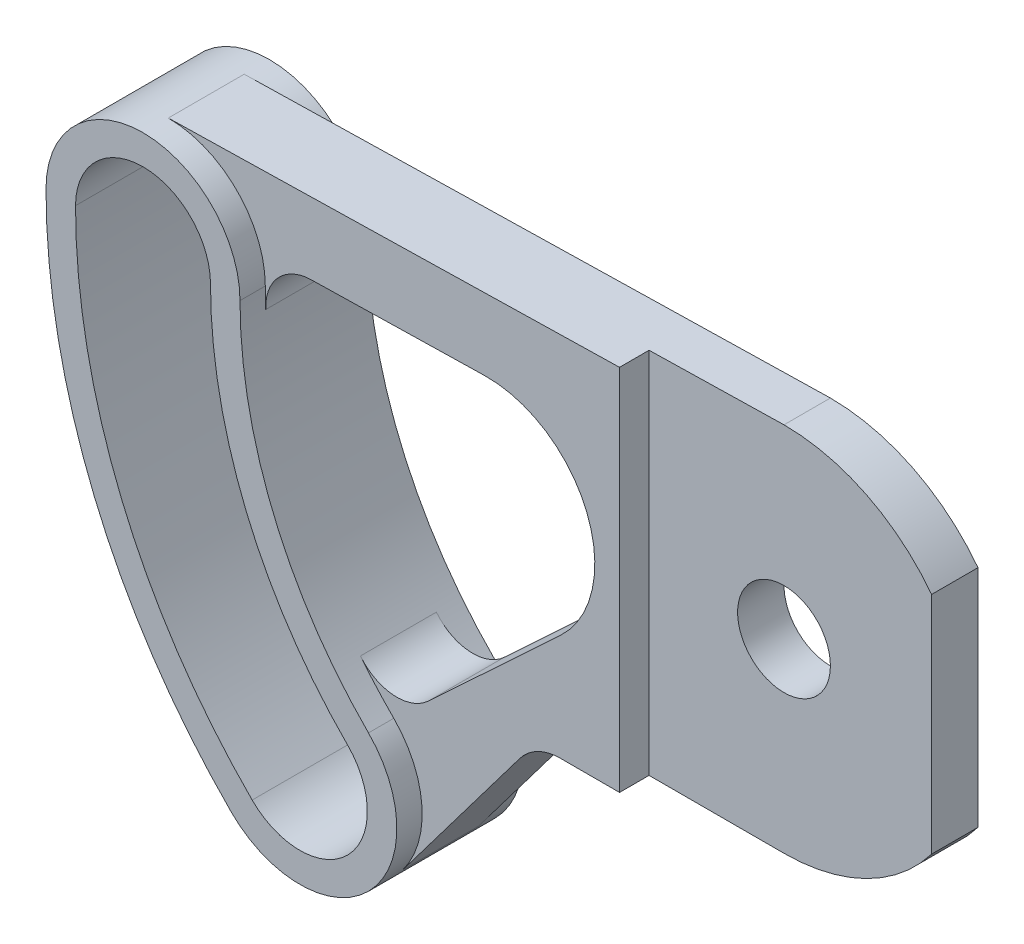
ISO-10303-21;
HEADER;
FILE_DESCRIPTION(('STEP AP214'),'2;1');
FILE_NAME('part.step','',(''),(''),'','','');
FILE_SCHEMA(('AUTOMOTIVE_DESIGN { 1 0 10303 214 1 1 1 1 }'));
ENDSEC;
DATA;
#1=APPLICATION_CONTEXT('core data for automotive mechanical design processes');
#2=APPLICATION_PROTOCOL_DEFINITION('international standard','automotive_design',2000,#1);
#3=PRODUCT_CONTEXT('',#1,'mechanical');
#4=PRODUCT('Part','Part','',(#3));
#5=PRODUCT_RELATED_PRODUCT_CATEGORY('part','',(#4));
#6=PRODUCT_DEFINITION_FORMATION('','',#4);
#7=PRODUCT_DEFINITION_CONTEXT('part definition',#1,'design');
#8=PRODUCT_DEFINITION('design','',#6,#7);
#9=PRODUCT_DEFINITION_SHAPE('','',#8);
#10=(LENGTH_UNIT() NAMED_UNIT(*) SI_UNIT(.MILLI.,.METRE.));
#11=(NAMED_UNIT(*) PLANE_ANGLE_UNIT() SI_UNIT($,.RADIAN.));
#12=(NAMED_UNIT(*) SI_UNIT($,.STERADIAN.) SOLID_ANGLE_UNIT());
#13=UNCERTAINTY_MEASURE_WITH_UNIT(LENGTH_MEASURE(1.E-05),#10,'distance_accuracy_value','');
#14=(GEOMETRIC_REPRESENTATION_CONTEXT(3) GLOBAL_UNCERTAINTY_ASSIGNED_CONTEXT((#13)) GLOBAL_UNIT_ASSIGNED_CONTEXT((#10,
#11,#12)) REPRESENTATION_CONTEXT('',''));
#15=CARTESIAN_POINT('',(0.,0.,0.));
#16=DIRECTION('',(0.,0.,1.));
#17=DIRECTION('',(1.,0.,0.));
#18=AXIS2_PLACEMENT_3D('',#15,#16,#17);
#19=CARTESIAN_POINT('',(0.,-44.,9.));
#20=DIRECTION('',(0.,-1.,0.));
#21=DIRECTION('',(1.,0.,0.));
#22=AXIS2_PLACEMENT_3D('',#19,#20,#21);
#23=PLANE('',#22);
#24=DIRECTION('',(1.,0.,0.));
#25=VECTOR('',#24,1.);
#26=CARTESIAN_POINT('',(0.,-44.,2.));
#27=LINE('',#26,#25);
#28=CARTESIAN_POINT('',(-32.,-44.,2.));
#29=VERTEX_POINT('',#28);
#30=CARTESIAN_POINT('',(0.,-44.,2.));
#31=VERTEX_POINT('',#30);
#32=EDGE_CURVE('E231',#29,#31,#27,.T.);
#33=ORIENTED_EDGE('',*,*,#32,.F.);
#34=DIRECTION('',(0.,0.,1.));
#35=VECTOR('',#34,1.);
#36=CARTESIAN_POINT('',(-32.,-44.,2.));
#37=LINE('',#36,#35);
#38=CARTESIAN_POINT('',(-32.,-44.,9.));
#39=VERTEX_POINT('',#38);
#40=EDGE_CURVE('E423',#29,#39,#37,.T.);
#41=ORIENTED_EDGE('',*,*,#40,.T.);
#42=DIRECTION('',(-1.,0.,0.));
#43=VECTOR('',#42,1.);
#44=CARTESIAN_POINT('',(0.,-44.,9.));
#45=LINE('',#44,#43);
#46=CARTESIAN_POINT('',(-46.0230624453333,-44.,9.));
#47=VERTEX_POINT('',#46);
#48=EDGE_CURVE('E412',#39,#47,#45,.T.);
#49=ORIENTED_EDGE('',*,*,#48,.T.);
#50=DIRECTION('',(0.,0.,-1.));
#51=VECTOR('',#50,1.);
#52=CARTESIAN_POINT('',(-46.0230624453333,-44.,9.));
#53=LINE('',#52,#51);
#54=CARTESIAN_POINT('',(-46.0230624453333,-44.,-9.));
#55=VERTEX_POINT('',#54);
#56=EDGE_CURVE('E256',#47,#55,#53,.T.);
#57=ORIENTED_EDGE('',*,*,#56,.T.);
#58=DIRECTION('',(-1.,0.,0.));
#59=VECTOR('',#58,1.);
#60=CARTESIAN_POINT('',(0.,-44.,-9.));
#61=LINE('',#60,#59);
#62=CARTESIAN_POINT('',(0.,-44.,-9.));
#63=VERTEX_POINT('',#62);
#64=EDGE_CURVE('E260',#63,#55,#61,.T.);
#65=ORIENTED_EDGE('',*,*,#64,.F.);
#66=DIRECTION('',(0.,0.,-1.));
#67=VECTOR('',#66,1.);
#68=CARTESIAN_POINT('',(0.,-44.,9.));
#69=LINE('',#68,#67);
#70=EDGE_CURVE('E248',#31,#63,#69,.T.);
#71=ORIENTED_EDGE('',*,*,#70,.F.);
#72=EDGE_LOOP('',(#33,#41,#49,#57,#65,#71));
#73=FACE_BOUND('',#72,.T.);
#74=ADVANCED_FACE('F61',(#73),#23,.T.);
#75=CARTESIAN_POINT('',(0.,0.,9.));
#76=DIRECTION('',(0.,0.,1.));
#77=DIRECTION('',(1.,0.,0.));
#78=AXIS2_PLACEMENT_3D('',#75,#76,#77);
#79=PLANE('',#78);
#80=ORIENTED_EDGE('',*,*,#48,.F.);
#81=DIRECTION('',(0.,1.,0.));
#82=VECTOR('',#81,1.);
#83=CARTESIAN_POINT('',(-32.,0.,9.));
#84=LINE('',#83,#82);
#85=CARTESIAN_POINT('',(-32.,43.3093525179856,9.));
#86=VERTEX_POINT('',#85);
#87=EDGE_CURVE('E243',#39,#86,#84,.T.);
#88=ORIENTED_EDGE('',*,*,#87,.T.);
#89=DIRECTION('',(0.999767174137652,0.0215777087943381,0.));
#90=VECTOR('',#89,1.);
#91=CARTESIAN_POINT('',(-0.949198137609943,43.9795137092602,9.));
#92=LINE('',#91,#90);
#93=CARTESIAN_POINT('',(-139.,41.,9.));
#94=VERTEX_POINT('',#93);
#95=EDGE_CURVE('E415',#94,#86,#92,.T.);
#96=ORIENTED_EDGE('',*,*,#95,.F.);
#97=CARTESIAN_POINT('',(-139.,18.,9.));
#98=DIRECTION('',(0.,0.,1.));
#99=DIRECTION('',(1.,0.,0.));
#100=AXIS2_PLACEMENT_3D('',#97,#98,#99);
#101=CIRCLE('',#100,23.);
#102=CARTESIAN_POINT('',(-116.,18.,9.));
#103=VERTEX_POINT('',#102);
#104=EDGE_CURVE('E418',#103,#94,#101,.T.);
#105=ORIENTED_EDGE('',*,*,#104,.F.);
#106=CARTESIAN_POINT('',(-12.,18.,9.));
#107=DIRECTION('',(0.,0.,1.));
#108=DIRECTION('',(1.,0.,0.));
#109=AXIS2_PLACEMENT_3D('',#106,#107,#108);
#110=CIRCLE('',#109,104.);
#111=CARTESIAN_POINT('',(-115.890292858977,13.2243273064394,9.));
#112=VERTEX_POINT('',#111);
#113=EDGE_CURVE('E346',#112,#103,#110,.F.);
#114=ORIENTED_EDGE('',*,*,#113,.F.);
#115=CARTESIAN_POINT('',(-104.901896498893,13.7294465336429,9.));
#116=DIRECTION('',(0.,0.,1.));
#117=DIRECTION('',(1.,0.,0.));
#118=AXIS2_PLACEMENT_3D('',#115,#116,#117);
#119=CIRCLE('',#118,11.);
#120=CARTESIAN_POINT('',(-105.139251295631,24.7268854491571,9.));
#121=VERTEX_POINT('',#120);
#122=EDGE_CURVE('E363',#112,#121,#119,.F.);
#123=ORIENTED_EDGE('',*,*,#122,.T.);
#124=DIRECTION('',(0.999767174137652,0.021577708794338,0.));
#125=VECTOR('',#124,1.);
#126=CARTESIAN_POINT('',(-0.582377883805446,26.9835086163188,9.));
#127=LINE('',#126,#125);
#128=CARTESIAN_POINT('',(-64.0329053283729,25.6140727721914,9.));
#129=VERTEX_POINT('',#128);
#130=EDGE_CURVE('E449',#121,#129,#127,.T.);
#131=ORIENTED_EDGE('',*,*,#130,.T.);
#132=CARTESIAN_POINT('',(-63.4800836138652,0.,9.));
#133=DIRECTION('',(0.,0.,1.));
#134=DIRECTION('',(1.,0.,0.));
#135=AXIS2_PLACEMENT_3D('',#132,#133,#134);
#136=CIRCLE('',#135,25.6200377795808);
#137=CARTESIAN_POINT('',(-46.0230624453333,-18.7520331630621,9.));
#138=VERTEX_POINT('',#137);
#139=EDGE_CURVE('E403',#138,#129,#136,.T.);
#140=ORIENTED_EDGE('',*,*,#139,.F.);
#141=DIRECTION('',(-0.731928396218349,-0.681381554497357,0.));
#142=VECTOR('',#141,1.);
#143=CARTESIAN_POINT('',(-12.0155642837125,12.9069133700336,9.));
#144=LINE('',#143,#142);
#145=CARTESIAN_POINT('',(-77.3274929863889,-47.894585433101,9.));
#146=VERTEX_POINT('',#145);
#147=EDGE_CURVE('E390',#138,#146,#144,.T.);
#148=ORIENTED_EDGE('',*,*,#147,.T.);
#149=CARTESIAN_POINT('',(-84.8226900858598,-39.8433730746991,9.));
#150=DIRECTION('',(0.,0.,1.));
#151=DIRECTION('',(1.,0.,0.));
#152=AXIS2_PLACEMENT_3D('',#149,#150,#151);
#153=CIRCLE('',#152,11.);
#154=CARTESIAN_POINT('',(-93.4361265476281,-46.6850623631044,9.));
#155=VERTEX_POINT('',#154);
#156=EDGE_CURVE('E12',#146,#155,#153,.F.);
#157=ORIENTED_EDGE('',*,*,#156,.T.);
#158=CARTESIAN_POINT('',(-12.,18.,9.));
#159=DIRECTION('',(0.,0.,1.));
#160=DIRECTION('',(1.,0.,0.));
#161=AXIS2_PLACEMENT_3D('',#158,#159,#160);
#162=CIRCLE('',#161,104.);
#163=CARTESIAN_POINT('',(-85.5391052434008,-55.5391052434011,9.));
#164=VERTEX_POINT('',#163);
#165=EDGE_CURVE('E79',#164,#155,#162,.F.);
#166=ORIENTED_EDGE('',*,*,#165,.F.);
#167=CARTESIAN_POINT('',(-101.802561210691,-71.8025612106917,9.));
#168=DIRECTION('',(0.,0.,1.));
#169=DIRECTION('',(1.,0.,0.));
#170=AXIS2_PLACEMENT_3D('',#167,#168,#169);
#171=CIRCLE('',#170,23.);
#172=CARTESIAN_POINT('',(-83.445115781445,-85.6591191278745,9.));
#173=VERTEX_POINT('',#172);
#174=EDGE_CURVE('E397',#173,#164,#171,.T.);
#175=ORIENTED_EDGE('',*,*,#174,.F.);
#176=DIRECTION('',(-0.602459039877512,-0.798149801271582,0.));
#177=VECTOR('',#176,1.);
#178=CARTESIAN_POINT('',(-11.9687287041228,9.03422990540433,9.));
#179=LINE('',#178,#177);
#180=CARTESIAN_POINT('',(-55.6008600605924,-48.7704915214699,9.));
#181=VERTEX_POINT('',#180);
#182=EDGE_CURVE('E402',#181,#173,#179,.T.);
#183=ORIENTED_EDGE('',*,*,#182,.F.);
#184=CARTESIAN_POINT('',(-46.0230624453333,-56.,9.));
#185=DIRECTION('',(0.,0.,1.));
#186=DIRECTION('',(1.,0.,0.));
#187=AXIS2_PLACEMENT_3D('',#184,#185,#186);
#188=CIRCLE('',#187,12.);
#189=EDGE_CURVE('E401',#47,#181,#188,.T.);
#190=ORIENTED_EDGE('',*,*,#189,.F.);
#191=EDGE_LOOP('',(#80,#88,#96,#105,#114,#123,#131,#140,#148,#157,#166,#175,#183,#190));
#192=FACE_BOUND('',#191,.T.);
#193=ADVANCED_FACE('F384',(#192),#79,.T.);
#194=CARTESIAN_POINT('',(0.,0.,9.));
#195=DIRECTION('',(0.,0.,-1.));
#196=DIRECTION('',(-1.,0.,0.));
#197=AXIS2_PLACEMENT_3D('',#194,#195,#196);
#198=CYLINDRICAL_SURFACE('',#197,44.);
#199=CARTESIAN_POINT('',(0.,0.,2.));
#200=DIRECTION('',(0.,0.,1.));
#201=DIRECTION('',(1.,0.,0.));
#202=AXIS2_PLACEMENT_3D('',#199,#200,#201);
#203=CIRCLE('',#202,44.);
#204=CARTESIAN_POINT('',(35.,-26.6645832519468,2.));
#205=VERTEX_POINT('',#204);
#206=EDGE_CURVE('E240',#31,#205,#203,.T.);
#207=ORIENTED_EDGE('',*,*,#206,.F.);
#208=ORIENTED_EDGE('',*,*,#70,.T.);
#209=CARTESIAN_POINT('',(0.,0.,-9.));
#210=DIRECTION('',(0.,0.,1.));
#211=DIRECTION('',(1.,0.,0.));
#212=AXIS2_PLACEMENT_3D('',#209,#210,#211);
#213=CIRCLE('',#212,44.);
#214=CARTESIAN_POINT('',(35.,-26.6645832519468,-9.));
#215=VERTEX_POINT('',#214);
#216=EDGE_CURVE('E431',#63,#215,#213,.T.);
#217=ORIENTED_EDGE('',*,*,#216,.T.);
#218=DIRECTION('',(0.,0.,-1.));
#219=VECTOR('',#218,1.);
#220=CARTESIAN_POINT('',(35.,-26.6645832519468,9.));
#221=LINE('',#220,#219);
#222=EDGE_CURVE('E252',#205,#215,#221,.T.);
#223=ORIENTED_EDGE('',*,*,#222,.F.);
#224=EDGE_LOOP('',(#207,#208,#217,#223));
#225=FACE_BOUND('',#224,.T.);
#226=ADVANCED_FACE('F250',(#225),#198,.T.);
#227=CARTESIAN_POINT('',(0.,0.,9.));
#228=DIRECTION('',(0.,0.,-1.));
#229=DIRECTION('',(-1.,0.,0.));
#230=AXIS2_PLACEMENT_3D('',#227,#228,#229);
#231=CYLINDRICAL_SURFACE('',#230,44.);
#232=CARTESIAN_POINT('',(0.,0.,2.));
#233=DIRECTION('',(0.,0.,1.));
#234=DIRECTION('',(1.,0.,0.));
#235=AXIS2_PLACEMENT_3D('',#232,#233,#234);
#236=CIRCLE('',#235,44.);
#237=CARTESIAN_POINT('',(35.,26.6645832519468,2.));
#238=VERTEX_POINT('',#237);
#239=CARTESIAN_POINT('',(-1.5330618718945E-13,44.,2.));
#240=VERTEX_POINT('',#239);
#241=EDGE_CURVE('E453',#238,#240,#236,.T.);
#242=ORIENTED_EDGE('',*,*,#241,.F.);
#243=DIRECTION('',(0.,0.,-1.));
#244=VECTOR('',#243,1.);
#245=CARTESIAN_POINT('',(35.,26.6645832519468,9.));
#246=LINE('',#245,#244);
#247=CARTESIAN_POINT('',(35.,26.6645832519468,-9.));
#248=VERTEX_POINT('',#247);
#249=EDGE_CURVE('E265',#238,#248,#246,.T.);
#250=ORIENTED_EDGE('',*,*,#249,.T.);
#251=CARTESIAN_POINT('',(0.,0.,-9.));
#252=DIRECTION('',(0.,0.,1.));
#253=DIRECTION('',(1.,0.,0.));
#254=AXIS2_PLACEMENT_3D('',#251,#252,#253);
#255=CIRCLE('',#254,44.);
#256=CARTESIAN_POINT('',(-1.53631447841196E-13,44.,-9.));
#257=VERTEX_POINT('',#256);
#258=EDGE_CURVE('E436',#248,#257,#255,.T.);
#259=ORIENTED_EDGE('',*,*,#258,.T.);
#260=DIRECTION('',(0.,0.,-1.));
#261=VECTOR('',#260,1.);
#262=CARTESIAN_POINT('',(-1.53631447841196E-13,44.,9.));
#263=LINE('',#262,#261);
#264=EDGE_CURVE('E450',#240,#257,#263,.T.);
#265=ORIENTED_EDGE('',*,*,#264,.F.);
#266=EDGE_LOOP('',(#242,#250,#259,#265));
#267=FACE_BOUND('',#266,.T.);
#268=ADVANCED_FACE('F454',(#267),#231,.T.);
#269=CARTESIAN_POINT('',(0.,0.,9.));
#270=DIRECTION('',(0.,0.,-1.));
#271=DIRECTION('',(-1.,0.,0.));
#272=AXIS2_PLACEMENT_3D('',#269,#270,#271);
#273=CYLINDRICAL_SURFACE('',#272,11.);
#274=CARTESIAN_POINT('',(0.,0.,-9.));
#275=DIRECTION('',(0.,0.,1.));
#276=DIRECTION('',(1.,0.,0.));
#277=AXIS2_PLACEMENT_3D('',#274,#275,#276);
#278=CIRCLE('',#277,11.);
#279=CARTESIAN_POINT('',(11.,0.,-9.));
#280=VERTEX_POINT('',#279);
#281=EDGE_CURVE('E444',#280,#280,#278,.T.);
#282=ORIENTED_EDGE('',*,*,#281,.F.);
#283=EDGE_LOOP('',(#282));
#284=FACE_BOUND('',#283,.T.);
#285=CARTESIAN_POINT('',(0.,0.,2.));
#286=DIRECTION('',(0.,0.,1.));
#287=DIRECTION('',(1.,0.,0.));
#288=AXIS2_PLACEMENT_3D('',#285,#286,#287);
#289=CIRCLE('',#288,11.);
#290=CARTESIAN_POINT('',(11.,0.,2.));
#291=VERTEX_POINT('',#290);
#292=EDGE_CURVE('E474',#291,#291,#289,.T.);
#293=ORIENTED_EDGE('',*,*,#292,.T.);
#294=EDGE_LOOP('',(#293));
#295=FACE_BOUND('',#294,.T.);
#296=ADVANCED_FACE('F543',(#284,#295),#273,.F.);
#297=CARTESIAN_POINT('',(-101.802561210691,-71.8025612106917,15.));
#298=DIRECTION('',(0.,0.,-1.));
#299=DIRECTION('',(-1.,0.,0.));
#300=AXIS2_PLACEMENT_3D('',#297,#298,#299);
#301=CYLINDRICAL_SURFACE('',#300,23.);
#302=CARTESIAN_POINT('',(-101.802561210691,-71.8025612106917,-9.));
#303=DIRECTION('',(0.,0.,1.));
#304=DIRECTION('',(1.,0.,0.));
#305=AXIS2_PLACEMENT_3D('',#302,#303,#304);
#306=CIRCLE('',#305,23.);
#307=CARTESIAN_POINT('',(-83.445115781445,-85.6591191278745,-9.));
#308=VERTEX_POINT('',#307);
#309=CARTESIAN_POINT('',(-85.5391052434008,-55.5391052434011,-9.));
#310=VERTEX_POINT('',#309);
#311=EDGE_CURVE('E379',#308,#310,#306,.T.);
#312=ORIENTED_EDGE('',*,*,#311,.F.);
#313=DIRECTION('',(0.,0.,-1.));
#314=VECTOR('',#313,1.);
#315=CARTESIAN_POINT('',(-83.445115781445,-85.6591191278745,9.));
#316=LINE('',#315,#314);
#317=EDGE_CURVE('E270',#173,#308,#316,.T.);
#318=ORIENTED_EDGE('',*,*,#317,.F.);
#319=ORIENTED_EDGE('',*,*,#174,.T.);
#320=DIRECTION('',(0.,0.,-1.));
#321=VECTOR('',#320,1.);
#322=CARTESIAN_POINT('',(-85.5391052434008,-55.5391052434011,15.));
#323=LINE('',#322,#321);
#324=CARTESIAN_POINT('',(-85.5391052434008,-55.5391052434011,15.));
#325=VERTEX_POINT('',#324);
#326=EDGE_CURVE('E327',#325,#164,#323,.T.);
#327=ORIENTED_EDGE('',*,*,#326,.F.);
#328=CARTESIAN_POINT('',(-101.802561210691,-71.8025612106917,15.));
#329=DIRECTION('',(0.,0.,1.));
#330=DIRECTION('',(1.,0.,0.));
#331=AXIS2_PLACEMENT_3D('',#328,#329,#330);
#332=CIRCLE('',#331,23.);
#333=CARTESIAN_POINT('',(-118.066017177982,-88.0660171779823,15.));
#334=VERTEX_POINT('',#333);
#335=EDGE_CURVE('E288',#334,#325,#332,.T.);
#336=ORIENTED_EDGE('',*,*,#335,.F.);
#337=DIRECTION('',(0.,0.,-1.));
#338=VECTOR('',#337,1.);
#339=CARTESIAN_POINT('',(-118.066017177982,-88.0660171779823,15.));
#340=LINE('',#339,#338);
#341=CARTESIAN_POINT('',(-118.066017177982,-88.0660171779823,-15.));
#342=VERTEX_POINT('',#341);
#343=EDGE_CURVE('E329',#334,#342,#340,.T.);
#344=ORIENTED_EDGE('',*,*,#343,.T.);
#345=CARTESIAN_POINT('',(-101.802561210691,-71.8025612106917,-15.));
#346=DIRECTION('',(0.,0.,1.));
#347=DIRECTION('',(1.,0.,0.));
#348=AXIS2_PLACEMENT_3D('',#345,#346,#347);
#349=CIRCLE('',#348,23.);
#350=CARTESIAN_POINT('',(-85.5391052434008,-55.5391052434011,-15.));
#351=VERTEX_POINT('',#350);
#352=EDGE_CURVE('E315',#342,#351,#349,.T.);
#353=ORIENTED_EDGE('',*,*,#352,.T.);
#354=EDGE_CURVE('E330',#310,#351,#323,.T.);
#355=ORIENTED_EDGE('',*,*,#354,.F.);
#356=EDGE_LOOP('',(#312,#318,#319,#327,#336,#344,#353,#355));
#357=FACE_BOUND('',#356,.T.);
#358=ADVANCED_FACE('F400',(#357),#301,.T.);
#359=CARTESIAN_POINT('',(-12.,18.,15.));
#360=DIRECTION('',(0.,0.,-1.));
#361=DIRECTION('',(-1.,0.,0.));
#362=AXIS2_PLACEMENT_3D('',#359,#360,#361);
#363=CYLINDRICAL_SURFACE('',#362,150.);
#364=CARTESIAN_POINT('',(-12.,18.,-15.));
#365=DIRECTION('',(0.,0.,1.));
#366=DIRECTION('',(1.,0.,0.));
#367=AXIS2_PLACEMENT_3D('',#364,#365,#366);
#368=CIRCLE('',#367,150.);
#369=CARTESIAN_POINT('',(-162.,18.,-15.));
#370=VERTEX_POINT('',#369);
#371=EDGE_CURVE('E310',#370,#342,#368,.T.);
#372=ORIENTED_EDGE('',*,*,#371,.T.);
#373=ORIENTED_EDGE('',*,*,#343,.F.);
#374=CARTESIAN_POINT('',(-12.,18.,15.));
#375=DIRECTION('',(0.,0.,1.));
#376=DIRECTION('',(1.,0.,0.));
#377=AXIS2_PLACEMENT_3D('',#374,#375,#376);
#378=CIRCLE('',#377,150.);
#379=CARTESIAN_POINT('',(-162.,18.,15.));
#380=VERTEX_POINT('',#379);
#381=EDGE_CURVE('E289',#380,#334,#378,.T.);
#382=ORIENTED_EDGE('',*,*,#381,.F.);
#383=DIRECTION('',(0.,0.,-1.));
#384=VECTOR('',#383,1.);
#385=CARTESIAN_POINT('',(-162.,18.,15.));
#386=LINE('',#385,#384);
#387=EDGE_CURVE('E317',#380,#370,#386,.T.);
#388=ORIENTED_EDGE('',*,*,#387,.T.);
#389=EDGE_LOOP('',(#372,#373,#382,#388));
#390=FACE_BOUND('',#389,.T.);
#391=ADVANCED_FACE('F539',(#390),#363,.T.);
#392=CARTESIAN_POINT('',(-12.,18.,15.));
#393=DIRECTION('',(0.,0.,-1.));
#394=DIRECTION('',(-1.,0.,0.));
#395=AXIS2_PLACEMENT_3D('',#392,#393,#394);
#396=CYLINDRICAL_SURFACE('',#395,104.);
#397=DIRECTION('',(0.,0.,-1.));
#398=VECTOR('',#397,1.);
#399=CARTESIAN_POINT('',(-116.,18.,15.));
#400=LINE('',#399,#398);
#401=CARTESIAN_POINT('',(-116.,18.,-9.));
#402=VERTEX_POINT('',#401);
#403=CARTESIAN_POINT('',(-116.,18.,-15.));
#404=VERTEX_POINT('',#403);
#405=EDGE_CURVE('E325',#402,#404,#400,.T.);
#406=ORIENTED_EDGE('',*,*,#405,.F.);
#407=CARTESIAN_POINT('',(-12.,18.,-9.));
#408=DIRECTION('',(0.,0.,1.));
#409=DIRECTION('',(1.,0.,0.));
#410=AXIS2_PLACEMENT_3D('',#407,#408,#409);
#411=CIRCLE('',#410,104.);
#412=CARTESIAN_POINT('',(-115.890292858977,13.2243273064394,-9.));
#413=VERTEX_POINT('',#412);
#414=EDGE_CURVE('E353',#402,#413,#411,.T.);
#415=ORIENTED_EDGE('',*,*,#414,.T.);
#416=DIRECTION('',(0.,0.,-1.));
#417=VECTOR('',#416,1.);
#418=CARTESIAN_POINT('',(-115.890292858977,13.2243273064394,15.));
#419=LINE('',#418,#417);
#420=EDGE_CURVE('E354',#413,#112,#419,.F.);
#421=ORIENTED_EDGE('',*,*,#420,.T.);
#422=ORIENTED_EDGE('',*,*,#113,.T.);
#423=CARTESIAN_POINT('',(-116.,18.,15.));
#424=VERTEX_POINT('',#423);
#425=EDGE_CURVE('E322',#424,#103,#400,.T.);
#426=ORIENTED_EDGE('',*,*,#425,.F.);
#427=CARTESIAN_POINT('',(-12.,18.,15.));
#428=DIRECTION('',(0.,0.,1.));
#429=DIRECTION('',(1.,0.,0.));
#430=AXIS2_PLACEMENT_3D('',#427,#428,#429);
#431=CIRCLE('',#430,104.);
#432=EDGE_CURVE('E295',#424,#325,#431,.T.);
#433=ORIENTED_EDGE('',*,*,#432,.T.);
#434=ORIENTED_EDGE('',*,*,#326,.T.);
#435=ORIENTED_EDGE('',*,*,#165,.T.);
#436=DIRECTION('',(0.,0.,-1.));
#437=VECTOR('',#436,1.);
#438=CARTESIAN_POINT('',(-93.4361265476281,-46.6850623631044,15.));
#439=LINE('',#438,#437);
#440=CARTESIAN_POINT('',(-93.4361265476281,-46.6850623631044,-9.));
#441=VERTEX_POINT('',#440);
#442=EDGE_CURVE('E345',#155,#441,#439,.T.);
#443=ORIENTED_EDGE('',*,*,#442,.T.);
#444=CARTESIAN_POINT('',(-12.,18.,-9.));
#445=DIRECTION('',(0.,0.,1.));
#446=DIRECTION('',(1.,0.,0.));
#447=AXIS2_PLACEMENT_3D('',#444,#445,#446);
#448=CIRCLE('',#447,104.);
#449=EDGE_CURVE('E347',#441,#310,#448,.T.);
#450=ORIENTED_EDGE('',*,*,#449,.T.);
#451=ORIENTED_EDGE('',*,*,#354,.T.);
#452=CARTESIAN_POINT('',(-12.,18.,-15.));
#453=DIRECTION('',(0.,0.,1.));
#454=DIRECTION('',(1.,0.,0.));
#455=AXIS2_PLACEMENT_3D('',#452,#453,#454);
#456=CIRCLE('',#455,104.);
#457=EDGE_CURVE('E312',#404,#351,#456,.T.);
#458=ORIENTED_EDGE('',*,*,#457,.F.);
#459=EDGE_LOOP('',(#406,#415,#421,#422,#426,#433,#434,#435,#443,#450,#451,#458));
#460=FACE_BOUND('',#459,.T.);
#461=ADVANCED_FACE('F388',(#460),#396,.F.);
#462=CARTESIAN_POINT('',(-139.,18.,15.));
#463=DIRECTION('',(0.,0.,-1.));
#464=DIRECTION('',(-1.,0.,0.));
#465=AXIS2_PLACEMENT_3D('',#462,#463,#464);
#466=CYLINDRICAL_SURFACE('',#465,16.);
#467=CARTESIAN_POINT('',(-139.,18.,-15.));
#468=DIRECTION('',(0.,0.,1.));
#469=DIRECTION('',(1.,0.,0.));
#470=AXIS2_PLACEMENT_3D('',#467,#468,#469);
#471=CIRCLE('',#470,16.);
#472=CARTESIAN_POINT('',(-123.,18.,-15.));
#473=VERTEX_POINT('',#472);
#474=CARTESIAN_POINT('',(-155.,18.,-15.));
#475=VERTEX_POINT('',#474);
#476=EDGE_CURVE('E273',#473,#475,#471,.T.);
#477=ORIENTED_EDGE('',*,*,#476,.F.);
#478=DIRECTION('',(0.,0.,-1.));
#479=VECTOR('',#478,1.);
#480=CARTESIAN_POINT('',(-123.,18.,15.));
#481=LINE('',#480,#479);
#482=CARTESIAN_POINT('',(-123.,18.,15.));
#483=VERTEX_POINT('',#482);
#484=EDGE_CURVE('E323',#483,#473,#481,.T.);
#485=ORIENTED_EDGE('',*,*,#484,.F.);
#486=CARTESIAN_POINT('',(-139.,18.,15.));
#487=DIRECTION('',(0.,0.,1.));
#488=DIRECTION('',(1.,0.,0.));
#489=AXIS2_PLACEMENT_3D('',#486,#487,#488);
#490=CIRCLE('',#489,16.);
#491=CARTESIAN_POINT('',(-155.,18.,15.));
#492=VERTEX_POINT('',#491);
#493=EDGE_CURVE('E274',#483,#492,#490,.T.);
#494=ORIENTED_EDGE('',*,*,#493,.T.);
#495=DIRECTION('',(0.,0.,-1.));
#496=VECTOR('',#495,1.);
#497=CARTESIAN_POINT('',(-155.,18.,15.));
#498=LINE('',#497,#496);
#499=EDGE_CURVE('E296',#492,#475,#498,.T.);
#500=ORIENTED_EDGE('',*,*,#499,.T.);
#501=EDGE_LOOP('',(#477,#485,#494,#500));
#502=FACE_BOUND('',#501,.T.);
#503=ADVANCED_FACE('F537',(#502),#466,.F.);
#504=CARTESIAN_POINT('',(-12.,18.,15.));
#505=DIRECTION('',(0.,0.,-1.));
#506=DIRECTION('',(-1.,0.,0.));
#507=AXIS2_PLACEMENT_3D('',#504,#505,#506);
#508=CYLINDRICAL_SURFACE('',#507,111.);
#509=CARTESIAN_POINT('',(-12.,18.,-15.));
#510=DIRECTION('',(0.,0.,1.));
#511=DIRECTION('',(1.,0.,0.));
#512=AXIS2_PLACEMENT_3D('',#509,#510,#511);
#513=CIRCLE('',#512,111.);
#514=CARTESIAN_POINT('',(-90.4888527117067,-60.488852711707,-15.));
#515=VERTEX_POINT('',#514);
#516=EDGE_CURVE('E297',#473,#515,#513,.T.);
#517=ORIENTED_EDGE('',*,*,#516,.T.);
#518=DIRECTION('',(0.,0.,-1.));
#519=VECTOR('',#518,1.);
#520=CARTESIAN_POINT('',(-90.4888527117067,-60.488852711707,15.));
#521=LINE('',#520,#519);
#522=CARTESIAN_POINT('',(-90.4888527117067,-60.488852711707,15.));
#523=VERTEX_POINT('',#522);
#524=EDGE_CURVE('E336',#523,#515,#521,.T.);
#525=ORIENTED_EDGE('',*,*,#524,.F.);
#526=CARTESIAN_POINT('',(-12.,18.,15.));
#527=DIRECTION('',(0.,0.,1.));
#528=DIRECTION('',(1.,0.,0.));
#529=AXIS2_PLACEMENT_3D('',#526,#527,#528);
#530=CIRCLE('',#529,111.);
#531=EDGE_CURVE('E279',#483,#523,#530,.T.);
#532=ORIENTED_EDGE('',*,*,#531,.F.);
#533=ORIENTED_EDGE('',*,*,#484,.T.);
#534=EDGE_LOOP('',(#517,#525,#532,#533));
#535=FACE_BOUND('',#534,.T.);
#536=ADVANCED_FACE('F554',(#535),#508,.T.);
#537=CARTESIAN_POINT('',(-101.802561210691,-71.8025612106917,15.));
#538=DIRECTION('',(0.,0.,-1.));
#539=DIRECTION('',(-1.,0.,0.));
#540=AXIS2_PLACEMENT_3D('',#537,#538,#539);
#541=CYLINDRICAL_SURFACE('',#540,16.);
#542=CARTESIAN_POINT('',(-101.802561210691,-71.8025612106917,-15.));
#543=DIRECTION('',(0.,0.,1.));
#544=DIRECTION('',(1.,0.,0.));
#545=AXIS2_PLACEMENT_3D('',#542,#543,#544);
#546=CIRCLE('',#545,16.);
#547=CARTESIAN_POINT('',(-113.116269709676,-83.1162697096764,-15.));
#548=VERTEX_POINT('',#547);
#549=EDGE_CURVE('E305',#548,#515,#546,.T.);
#550=ORIENTED_EDGE('',*,*,#549,.F.);
#551=DIRECTION('',(0.,0.,-1.));
#552=VECTOR('',#551,1.);
#553=CARTESIAN_POINT('',(-113.116269709676,-83.1162697096764,15.));
#554=LINE('',#553,#552);
#555=CARTESIAN_POINT('',(-113.116269709676,-83.1162697096764,15.));
#556=VERTEX_POINT('',#555);
#557=EDGE_CURVE('E333',#556,#548,#554,.T.);
#558=ORIENTED_EDGE('',*,*,#557,.F.);
#559=CARTESIAN_POINT('',(-101.802561210691,-71.8025612106917,15.));
#560=DIRECTION('',(0.,0.,1.));
#561=DIRECTION('',(1.,0.,0.));
#562=AXIS2_PLACEMENT_3D('',#559,#560,#561);
#563=CIRCLE('',#562,16.);
#564=EDGE_CURVE('E284',#556,#523,#563,.T.);
#565=ORIENTED_EDGE('',*,*,#564,.T.);
#566=ORIENTED_EDGE('',*,*,#524,.T.);
#567=EDGE_LOOP('',(#550,#558,#565,#566));
#568=FACE_BOUND('',#567,.T.);
#569=ADVANCED_FACE('F548',(#568),#541,.F.);
#570=CARTESIAN_POINT('',(-12.,18.,15.));
#571=DIRECTION('',(0.,0.,-1.));
#572=DIRECTION('',(-1.,0.,0.));
#573=AXIS2_PLACEMENT_3D('',#570,#571,#572);
#574=CYLINDRICAL_SURFACE('',#573,143.);
#575=CARTESIAN_POINT('',(-12.,18.,-15.));
#576=DIRECTION('',(0.,0.,1.));
#577=DIRECTION('',(1.,0.,0.));
#578=AXIS2_PLACEMENT_3D('',#575,#576,#577);
#579=CIRCLE('',#578,143.);
#580=EDGE_CURVE('E308',#475,#548,#579,.T.);
#581=ORIENTED_EDGE('',*,*,#580,.F.);
#582=ORIENTED_EDGE('',*,*,#499,.F.);
#583=CARTESIAN_POINT('',(-12.,18.,15.));
#584=DIRECTION('',(0.,0.,1.));
#585=DIRECTION('',(1.,0.,0.));
#586=AXIS2_PLACEMENT_3D('',#583,#584,#585);
#587=CIRCLE('',#586,143.);
#588=EDGE_CURVE('E283',#492,#556,#587,.T.);
#589=ORIENTED_EDGE('',*,*,#588,.T.);
#590=ORIENTED_EDGE('',*,*,#557,.T.);
#591=EDGE_LOOP('',(#581,#582,#589,#590));
#592=FACE_BOUND('',#591,.T.);
#593=ADVANCED_FACE('F536',(#592),#574,.F.);
#594=CARTESIAN_POINT('',(-139.,18.,15.));
#595=DIRECTION('',(0.,0.,-1.));
#596=DIRECTION('',(-1.,0.,0.));
#597=AXIS2_PLACEMENT_3D('',#594,#595,#596);
#598=CYLINDRICAL_SURFACE('',#597,23.);
#599=CARTESIAN_POINT('',(-139.,18.,-9.));
#600=DIRECTION('',(0.,0.,1.));
#601=DIRECTION('',(1.,0.,0.));
#602=AXIS2_PLACEMENT_3D('',#599,#600,#601);
#603=CIRCLE('',#602,23.);
#604=CARTESIAN_POINT('',(-139.,41.,-9.));
#605=VERTEX_POINT('',#604);
#606=EDGE_CURVE('E81',#402,#605,#603,.T.);
#607=ORIENTED_EDGE('',*,*,#606,.F.);
#608=ORIENTED_EDGE('',*,*,#405,.T.);
#609=CARTESIAN_POINT('',(-139.,18.,-15.));
#610=DIRECTION('',(0.,0.,1.));
#611=DIRECTION('',(1.,0.,0.));
#612=AXIS2_PLACEMENT_3D('',#609,#610,#611);
#613=CIRCLE('',#612,23.);
#614=EDGE_CURVE('E276',#404,#370,#613,.T.);
#615=ORIENTED_EDGE('',*,*,#614,.T.);
#616=ORIENTED_EDGE('',*,*,#387,.F.);
#617=CARTESIAN_POINT('',(-139.,18.,15.));
#618=DIRECTION('',(0.,0.,1.));
#619=DIRECTION('',(1.,0.,0.));
#620=AXIS2_PLACEMENT_3D('',#617,#618,#619);
#621=CIRCLE('',#620,23.);
#622=EDGE_CURVE('E293',#424,#380,#621,.T.);
#623=ORIENTED_EDGE('',*,*,#622,.F.);
#624=ORIENTED_EDGE('',*,*,#425,.T.);
#625=ORIENTED_EDGE('',*,*,#104,.T.);
#626=DIRECTION('',(0.,0.,-1.));
#627=VECTOR('',#626,1.);
#628=CARTESIAN_POINT('',(-139.,41.,9.));
#629=LINE('',#628,#627);
#630=EDGE_CURVE('E416',#94,#605,#629,.T.);
#631=ORIENTED_EDGE('',*,*,#630,.T.);
#632=EDGE_LOOP('',(#607,#608,#615,#616,#623,#624,#625,#631));
#633=FACE_BOUND('',#632,.T.);
#634=ADVANCED_FACE('F530',(#633),#598,.T.);
#635=CARTESIAN_POINT('',(0.,0.,15.));
#636=DIRECTION('',(0.,0.,1.));
#637=DIRECTION('',(1.,0.,0.));
#638=AXIS2_PLACEMENT_3D('',#635,#636,#637);
#639=PLANE('',#638);
#640=ORIENTED_EDGE('',*,*,#493,.F.);
#641=ORIENTED_EDGE('',*,*,#531,.T.);
#642=ORIENTED_EDGE('',*,*,#564,.F.);
#643=ORIENTED_EDGE('',*,*,#588,.F.);
#644=EDGE_LOOP('',(#640,#641,#642,#643));
#645=FACE_BOUND('',#644,.T.);
#646=ORIENTED_EDGE('',*,*,#381,.T.);
#647=ORIENTED_EDGE('',*,*,#335,.T.);
#648=ORIENTED_EDGE('',*,*,#432,.F.);
#649=ORIENTED_EDGE('',*,*,#622,.T.);
#650=EDGE_LOOP('',(#646,#647,#648,#649));
#651=FACE_BOUND('',#650,.T.);
#652=ADVANCED_FACE('F528',(#645,#651),#639,.T.);
#653=CARTESIAN_POINT('',(0.,0.,-15.));
#654=DIRECTION('',(0.,0.,1.));
#655=DIRECTION('',(1.,0.,0.));
#656=AXIS2_PLACEMENT_3D('',#653,#654,#655);
#657=PLANE('',#656);
#658=ORIENTED_EDGE('',*,*,#476,.T.);
#659=ORIENTED_EDGE('',*,*,#580,.T.);
#660=ORIENTED_EDGE('',*,*,#549,.T.);
#661=ORIENTED_EDGE('',*,*,#516,.F.);
#662=EDGE_LOOP('',(#658,#659,#660,#661));
#663=FACE_BOUND('',#662,.T.);
#664=ORIENTED_EDGE('',*,*,#371,.F.);
#665=ORIENTED_EDGE('',*,*,#614,.F.);
#666=ORIENTED_EDGE('',*,*,#457,.T.);
#667=ORIENTED_EDGE('',*,*,#352,.F.);
#668=EDGE_LOOP('',(#664,#665,#666,#667));
#669=FACE_BOUND('',#668,.T.);
#670=ADVANCED_FACE('F523',(#663,#669),#657,.F.);
#671=CARTESIAN_POINT('',(-0.582377883805446,26.9835086163188,9.));
#672=DIRECTION('',(-0.021577708794338,0.999767174137652,0.));
#673=DIRECTION('',(-0.999767174137652,-0.021577708794338,0.));
#674=AXIS2_PLACEMENT_3D('',#671,#672,#673);
#675=PLANE('',#674);
#676=ORIENTED_EDGE('',*,*,#130,.F.);
#677=DIRECTION('',(0.,0.,-1.));
#678=VECTOR('',#677,1.);
#679=CARTESIAN_POINT('',(-105.139251295631,24.7268854491571,9.));
#680=LINE('',#679,#678);
#681=CARTESIAN_POINT('',(-105.139251295631,24.7268854491571,-9.));
#682=VERTEX_POINT('',#681);
#683=EDGE_CURVE('E334',#121,#682,#680,.T.);
#684=ORIENTED_EDGE('',*,*,#683,.T.);
#685=DIRECTION('',(0.999767174137652,0.021577708794338,0.));
#686=VECTOR('',#685,1.);
#687=CARTESIAN_POINT('',(-0.582377883805446,26.9835086163188,-9.));
#688=LINE('',#687,#686);
#689=CARTESIAN_POINT('',(-64.0329053283729,25.6140727721914,-9.));
#690=VERTEX_POINT('',#689);
#691=EDGE_CURVE('E420',#682,#690,#688,.T.);
#692=ORIENTED_EDGE('',*,*,#691,.T.);
#693=DIRECTION('',(0.,0.,-1.));
#694=VECTOR('',#693,1.);
#695=CARTESIAN_POINT('',(-64.0329053283729,25.6140727721914,9.));
#696=LINE('',#695,#694);
#697=EDGE_CURVE('E271',#129,#690,#696,.T.);
#698=ORIENTED_EDGE('',*,*,#697,.F.);
#699=EDGE_LOOP('',(#676,#684,#692,#698));
#700=FACE_BOUND('',#699,.T.);
#701=ADVANCED_FACE('F486',(#700),#675,.F.);
#702=CARTESIAN_POINT('',(-63.4800836138652,0.,9.));
#703=DIRECTION('',(0.,0.,-1.));
#704=DIRECTION('',(-1.,0.,0.));
#705=AXIS2_PLACEMENT_3D('',#702,#703,#704);
#706=CYLINDRICAL_SURFACE('',#705,25.6200377795808);
#707=CARTESIAN_POINT('',(-63.4800836138652,0.,-9.));
#708=DIRECTION('',(0.,0.,1.));
#709=DIRECTION('',(1.,0.,0.));
#710=AXIS2_PLACEMENT_3D('',#707,#708,#709);
#711=CIRCLE('',#710,25.6200377795808);
#712=CARTESIAN_POINT('',(-46.0230624453333,-18.7520331630621,-9.));
#713=VERTEX_POINT('',#712);
#714=EDGE_CURVE('E381',#713,#690,#711,.T.);
#715=ORIENTED_EDGE('',*,*,#714,.F.);
#716=DIRECTION('',(0.,0.,-1.));
#717=VECTOR('',#716,1.);
#718=CARTESIAN_POINT('',(-46.0230624453333,-18.7520331630621,9.));
#719=LINE('',#718,#717);
#720=EDGE_CURVE('E267',#138,#713,#719,.T.);
#721=ORIENTED_EDGE('',*,*,#720,.F.);
#722=ORIENTED_EDGE('',*,*,#139,.T.);
#723=ORIENTED_EDGE('',*,*,#697,.T.);
#724=EDGE_LOOP('',(#715,#721,#722,#723));
#725=FACE_BOUND('',#724,.T.);
#726=ADVANCED_FACE('F477',(#725),#706,.F.);
#727=CARTESIAN_POINT('',(-12.0155642837125,12.9069133700336,9.));
#728=DIRECTION('',(0.681381554497357,-0.731928396218349,0.));
#729=DIRECTION('',(0.731928396218349,0.681381554497357,0.));
#730=AXIS2_PLACEMENT_3D('',#727,#728,#729);
#731=PLANE('',#730);
#732=DIRECTION('',(-0.731928396218349,-0.681381554497357,0.));
#733=VECTOR('',#732,1.);
#734=CARTESIAN_POINT('',(-12.0155642837125,12.9069133700336,-9.));
#735=LINE('',#734,#733);
#736=CARTESIAN_POINT('',(-77.3274929863889,-47.894585433101,-9.));
#737=VERTEX_POINT('',#736);
#738=EDGE_CURVE('E367',#713,#737,#735,.T.);
#739=ORIENTED_EDGE('',*,*,#738,.T.);
#740=DIRECTION('',(0.,0.,-1.));
#741=VECTOR('',#740,1.);
#742=CARTESIAN_POINT('',(-77.3274929863888,-47.894585433101,9.));
#743=LINE('',#742,#741);
#744=EDGE_CURVE('E359',#737,#146,#743,.F.);
#745=ORIENTED_EDGE('',*,*,#744,.T.);
#746=ORIENTED_EDGE('',*,*,#147,.F.);
#747=ORIENTED_EDGE('',*,*,#720,.T.);
#748=EDGE_LOOP('',(#739,#745,#746,#747));
#749=FACE_BOUND('',#748,.T.);
#750=ADVANCED_FACE('F380',(#749),#731,.F.);
#751=CARTESIAN_POINT('',(-11.9687287041228,9.03422990540433,9.));
#752=DIRECTION('',(0.798149801271582,-0.602459039877512,0.));
#753=DIRECTION('',(0.602459039877512,0.798149801271582,0.));
#754=AXIS2_PLACEMENT_3D('',#751,#752,#753);
#755=PLANE('',#754);
#756=DIRECTION('',(-0.602459039877512,-0.798149801271582,0.));
#757=VECTOR('',#756,1.);
#758=CARTESIAN_POINT('',(-11.9687287041228,9.03422990540433,-9.));
#759=LINE('',#758,#757);
#760=CARTESIAN_POINT('',(-55.6008600605924,-48.7704915214699,-9.));
#761=VERTEX_POINT('',#760);
#762=EDGE_CURVE('E424',#761,#308,#759,.T.);
#763=ORIENTED_EDGE('',*,*,#762,.F.);
#764=DIRECTION('',(0.,0.,-1.));
#765=VECTOR('',#764,1.);
#766=CARTESIAN_POINT('',(-55.6008600605924,-48.7704915214699,9.));
#767=LINE('',#766,#765);
#768=EDGE_CURVE('E257',#181,#761,#767,.T.);
#769=ORIENTED_EDGE('',*,*,#768,.F.);
#770=ORIENTED_EDGE('',*,*,#182,.T.);
#771=ORIENTED_EDGE('',*,*,#317,.T.);
#772=EDGE_LOOP('',(#763,#769,#770,#771));
#773=FACE_BOUND('',#772,.T.);
#774=ADVANCED_FACE('F514',(#773),#755,.T.);
#775=CARTESIAN_POINT('',(-46.0230624453333,-56.,9.));
#776=DIRECTION('',(0.,0.,-1.));
#777=DIRECTION('',(-1.,0.,0.));
#778=AXIS2_PLACEMENT_3D('',#775,#776,#777);
#779=CYLINDRICAL_SURFACE('',#778,12.);
#780=CARTESIAN_POINT('',(-46.0230624453333,-56.,-9.));
#781=DIRECTION('',(0.,0.,1.));
#782=DIRECTION('',(1.,0.,0.));
#783=AXIS2_PLACEMENT_3D('',#780,#781,#782);
#784=CIRCLE('',#783,12.);
#785=EDGE_CURVE('E430',#55,#761,#784,.T.);
#786=ORIENTED_EDGE('',*,*,#785,.F.);
#787=ORIENTED_EDGE('',*,*,#56,.F.);
#788=ORIENTED_EDGE('',*,*,#189,.T.);
#789=ORIENTED_EDGE('',*,*,#768,.T.);
#790=EDGE_LOOP('',(#786,#787,#788,#789));
#791=FACE_BOUND('',#790,.T.);
#792=ADVANCED_FACE('F515',(#791),#779,.F.);
#793=CARTESIAN_POINT('',(35.,0.,9.));
#794=DIRECTION('',(-1.,0.,0.));
#795=DIRECTION('',(0.,0.,1.));
#796=AXIS2_PLACEMENT_3D('',#793,#794,#795);
#797=PLANE('',#796);
#798=ORIENTED_EDGE('',*,*,#249,.F.);
#799=DIRECTION('',(0.,-1.,0.));
#800=VECTOR('',#799,1.);
#801=CARTESIAN_POINT('',(35.,0.,2.));
#802=LINE('',#801,#800);
#803=EDGE_CURVE('E251',#238,#205,#802,.T.);
#804=ORIENTED_EDGE('',*,*,#803,.T.);
#805=ORIENTED_EDGE('',*,*,#222,.T.);
#806=DIRECTION('',(0.,1.,0.));
#807=VECTOR('',#806,1.);
#808=CARTESIAN_POINT('',(35.,0.,-9.));
#809=LINE('',#808,#807);
#810=EDGE_CURVE('E433',#215,#248,#809,.T.);
#811=ORIENTED_EDGE('',*,*,#810,.T.);
#812=EDGE_LOOP('',(#798,#804,#805,#811));
#813=FACE_BOUND('',#812,.T.);
#814=ADVANCED_FACE('F456',(#813),#797,.F.);
#815=CARTESIAN_POINT('',(-0.949198137609943,43.9795137092602,9.));
#816=DIRECTION('',(-0.0215777087943381,0.999767174137652,0.));
#817=DIRECTION('',(-0.999767174137652,-0.0215777087943381,0.));
#818=AXIS2_PLACEMENT_3D('',#815,#816,#817);
#819=PLANE('',#818);
#820=DIRECTION('',(-0.999767174137652,-0.0215777087943381,0.));
#821=VECTOR('',#820,1.);
#822=CARTESIAN_POINT('',(-0.949198137609943,43.9795137092602,2.));
#823=LINE('',#822,#821);
#824=CARTESIAN_POINT('',(-32.,43.3093525179856,2.));
#825=VERTEX_POINT('',#824);
#826=EDGE_CURVE('E467',#240,#825,#823,.T.);
#827=ORIENTED_EDGE('',*,*,#826,.F.);
#828=ORIENTED_EDGE('',*,*,#264,.T.);
#829=DIRECTION('',(0.999767174137652,0.0215777087943381,0.));
#830=VECTOR('',#829,1.);
#831=CARTESIAN_POINT('',(-0.949198137609943,43.9795137092602,-9.));
#832=LINE('',#831,#830);
#833=EDGE_CURVE('E438',#605,#257,#832,.T.);
#834=ORIENTED_EDGE('',*,*,#833,.F.);
#835=ORIENTED_EDGE('',*,*,#630,.F.);
#836=ORIENTED_EDGE('',*,*,#95,.T.);
#837=DIRECTION('',(0.,0.,1.));
#838=VECTOR('',#837,1.);
#839=CARTESIAN_POINT('',(-32.,43.3093525179856,2.));
#840=LINE('',#839,#838);
#841=EDGE_CURVE('E469',#825,#86,#840,.T.);
#842=ORIENTED_EDGE('',*,*,#841,.F.);
#843=EDGE_LOOP('',(#827,#828,#834,#835,#836,#842));
#844=FACE_BOUND('',#843,.T.);
#845=ADVANCED_FACE('F465',(#844),#819,.T.);
#846=CARTESIAN_POINT('',(0.,0.,-9.));
#847=DIRECTION('',(0.,0.,1.));
#848=DIRECTION('',(1.,0.,0.));
#849=AXIS2_PLACEMENT_3D('',#846,#847,#848);
#850=PLANE('',#849);
#851=ORIENTED_EDGE('',*,*,#691,.F.);
#852=CARTESIAN_POINT('',(-104.901896498893,13.7294465336429,-9.));
#853=DIRECTION('',(0.,0.,1.));
#854=DIRECTION('',(1.,0.,0.));
#855=AXIS2_PLACEMENT_3D('',#852,#853,#854);
#856=CIRCLE('',#855,11.);
#857=EDGE_CURVE('E356',#682,#413,#856,.T.);
#858=ORIENTED_EDGE('',*,*,#857,.T.);
#859=ORIENTED_EDGE('',*,*,#414,.F.);
#860=ORIENTED_EDGE('',*,*,#606,.T.);
#861=ORIENTED_EDGE('',*,*,#833,.T.);
#862=ORIENTED_EDGE('',*,*,#258,.F.);
#863=ORIENTED_EDGE('',*,*,#810,.F.);
#864=ORIENTED_EDGE('',*,*,#216,.F.);
#865=ORIENTED_EDGE('',*,*,#64,.T.);
#866=ORIENTED_EDGE('',*,*,#785,.T.);
#867=ORIENTED_EDGE('',*,*,#762,.T.);
#868=ORIENTED_EDGE('',*,*,#311,.T.);
#869=ORIENTED_EDGE('',*,*,#449,.F.);
#870=CARTESIAN_POINT('',(-84.8226900858598,-39.8433730746991,-9.));
#871=DIRECTION('',(0.,0.,1.));
#872=DIRECTION('',(1.,0.,0.));
#873=AXIS2_PLACEMENT_3D('',#870,#871,#872);
#874=CIRCLE('',#873,11.);
#875=EDGE_CURVE('E68',#441,#737,#874,.T.);
#876=ORIENTED_EDGE('',*,*,#875,.T.);
#877=ORIENTED_EDGE('',*,*,#738,.F.);
#878=ORIENTED_EDGE('',*,*,#714,.T.);
#879=EDGE_LOOP('',(#851,#858,#859,#860,#861,#862,#863,#864,#865,#866,#867,#868,#869,#876,#877,#878));
#880=FACE_BOUND('',#879,.T.);
#881=ORIENTED_EDGE('',*,*,#281,.T.);
#882=EDGE_LOOP('',(#881));
#883=FACE_BOUND('',#882,.T.);
#884=ADVANCED_FACE('F370',(#880,#883),#850,.F.);
#885=CARTESIAN_POINT('',(-32.,0.,2.));
#886=DIRECTION('',(1.,0.,0.));
#887=DIRECTION('',(0.,1.,0.));
#888=AXIS2_PLACEMENT_3D('',#885,#886,#887);
#889=PLANE('',#888);
#890=ORIENTED_EDGE('',*,*,#87,.F.);
#891=ORIENTED_EDGE('',*,*,#40,.F.);
#892=DIRECTION('',(0.,1.,0.));
#893=VECTOR('',#892,1.);
#894=CARTESIAN_POINT('',(-32.,0.,2.));
#895=LINE('',#894,#893);
#896=EDGE_CURVE('E238',#29,#825,#895,.T.);
#897=ORIENTED_EDGE('',*,*,#896,.T.);
#898=ORIENTED_EDGE('',*,*,#841,.T.);
#899=EDGE_LOOP('',(#890,#891,#897,#898));
#900=FACE_BOUND('',#899,.T.);
#901=ADVANCED_FACE('F500',(#900),#889,.T.);
#902=CARTESIAN_POINT('',(0.,0.,2.));
#903=DIRECTION('',(0.,0.,1.));
#904=DIRECTION('',(1.,0.,0.));
#905=AXIS2_PLACEMENT_3D('',#902,#903,#904);
#906=PLANE('',#905);
#907=ORIENTED_EDGE('',*,*,#292,.F.);
#908=EDGE_LOOP('',(#907));
#909=FACE_BOUND('',#908,.T.);
#910=ORIENTED_EDGE('',*,*,#32,.T.);
#911=ORIENTED_EDGE('',*,*,#206,.T.);
#912=ORIENTED_EDGE('',*,*,#803,.F.);
#913=ORIENTED_EDGE('',*,*,#241,.T.);
#914=ORIENTED_EDGE('',*,*,#826,.T.);
#915=ORIENTED_EDGE('',*,*,#896,.F.);
#916=EDGE_LOOP('',(#910,#911,#912,#913,#914,#915));
#917=FACE_BOUND('',#916,.T.);
#918=ADVANCED_FACE('F237',(#909,#917),#906,.T.);
#919=CARTESIAN_POINT('',(-104.901896498893,13.7294465336429,15.));
#920=DIRECTION('',(0.,0.,-1.));
#921=DIRECTION('',(-1.,0.,0.));
#922=AXIS2_PLACEMENT_3D('',#919,#920,#921);
#923=CYLINDRICAL_SURFACE('',#922,11.);
#924=ORIENTED_EDGE('',*,*,#122,.F.);
#925=ORIENTED_EDGE('',*,*,#420,.F.);
#926=ORIENTED_EDGE('',*,*,#857,.F.);
#927=ORIENTED_EDGE('',*,*,#683,.F.);
#928=EDGE_LOOP('',(#924,#925,#926,#927));
#929=FACE_BOUND('',#928,.T.);
#930=ADVANCED_FACE('F489',(#929),#923,.F.);
#931=CARTESIAN_POINT('',(-84.8226900858598,-39.8433730746991,15.));
#932=DIRECTION('',(0.,0.,-1.));
#933=DIRECTION('',(-1.,0.,0.));
#934=AXIS2_PLACEMENT_3D('',#931,#932,#933);
#935=CYLINDRICAL_SURFACE('',#934,11.);
#936=ORIENTED_EDGE('',*,*,#156,.F.);
#937=ORIENTED_EDGE('',*,*,#744,.F.);
#938=ORIENTED_EDGE('',*,*,#875,.F.);
#939=ORIENTED_EDGE('',*,*,#442,.F.);
#940=EDGE_LOOP('',(#936,#937,#938,#939));
#941=FACE_BOUND('',#940,.T.);
#942=ADVANCED_FACE('F63',(#941),#935,.F.);
#943=CLOSED_SHELL('',(#74,#193,#226,#268,#296,#358,#391,#461,#503,#536,#569,#593,#634,#652,#670,
#701,#726,#750,#774,#792,#814,#845,#884,#901,#918,#930,#942));
#944=MANIFOLD_SOLID_BREP('B2',#943);
#945=ADVANCED_BREP_SHAPE_REPRESENTATION('',(#18,#944),#14);
#946=SHAPE_DEFINITION_REPRESENTATION(#9,#945);
ENDSEC;
END-ISO-10303-21;
